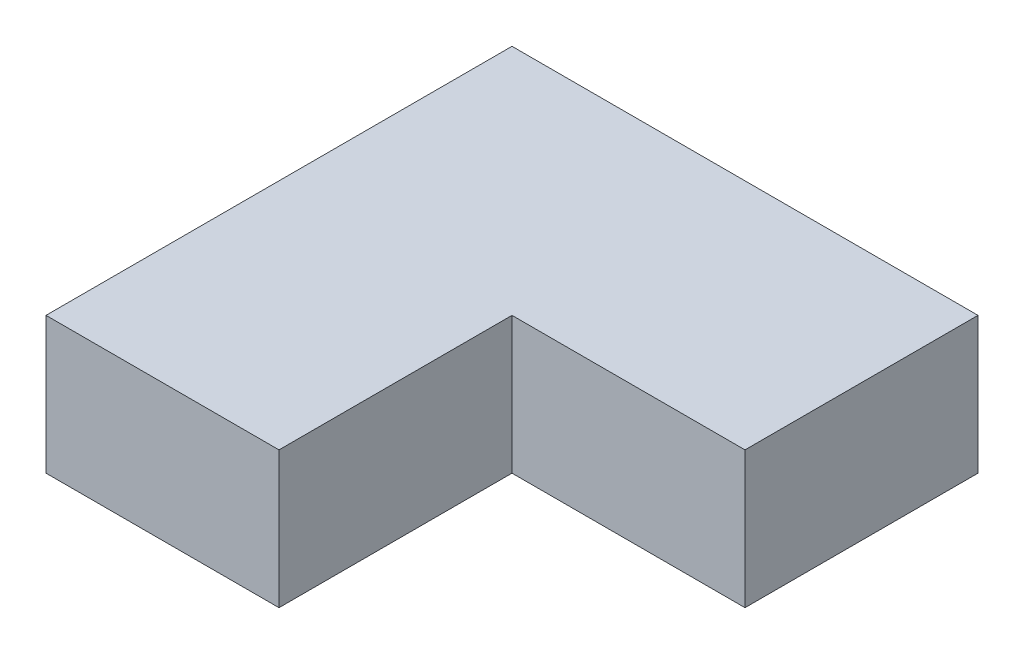
ISO-10303-21;
HEADER;
FILE_DESCRIPTION(('STEP AP214'),'2;1');
FILE_NAME('part.step','',(''),(''),'','','');
FILE_SCHEMA(('AUTOMOTIVE_DESIGN { 1 0 10303 214 1 1 1 1 }'));
ENDSEC;
DATA;
#1=APPLICATION_CONTEXT('core data for automotive mechanical design processes');
#2=APPLICATION_PROTOCOL_DEFINITION('international standard','automotive_design',2000,#1);
#3=PRODUCT_CONTEXT('',#1,'mechanical');
#4=PRODUCT('Part','Part','',(#3));
#5=PRODUCT_RELATED_PRODUCT_CATEGORY('part','',(#4));
#6=PRODUCT_DEFINITION_FORMATION('','',#4);
#7=PRODUCT_DEFINITION_CONTEXT('part definition',#1,'design');
#8=PRODUCT_DEFINITION('design','',#6,#7);
#9=PRODUCT_DEFINITION_SHAPE('','',#8);
#10=(LENGTH_UNIT() NAMED_UNIT(*) SI_UNIT(.MILLI.,.METRE.));
#11=(NAMED_UNIT(*) PLANE_ANGLE_UNIT() SI_UNIT($,.RADIAN.));
#12=(NAMED_UNIT(*) SI_UNIT($,.STERADIAN.) SOLID_ANGLE_UNIT());
#13=UNCERTAINTY_MEASURE_WITH_UNIT(LENGTH_MEASURE(1.E-05),#10,'distance_accuracy_value','');
#14=(GEOMETRIC_REPRESENTATION_CONTEXT(3) GLOBAL_UNCERTAINTY_ASSIGNED_CONTEXT((#13)) GLOBAL_UNIT_ASSIGNED_CONTEXT((#10,
#11,#12)) REPRESENTATION_CONTEXT('',''));
#15=CARTESIAN_POINT('',(0.,0.,0.));
#16=DIRECTION('',(0.,0.,1.));
#17=DIRECTION('',(1.,0.,0.));
#18=AXIS2_PLACEMENT_3D('',#15,#16,#17);
#19=CARTESIAN_POINT('',(37.5,22.,-37.5));
#20=DIRECTION('',(-1.,0.,0.));
#21=DIRECTION('',(0.,0.,1.));
#22=AXIS2_PLACEMENT_3D('',#19,#20,#21);
#23=PLANE('',#22);
#24=DIRECTION('',(0.,0.,-1.));
#25=VECTOR('',#24,1.);
#26=CARTESIAN_POINT('',(37.5,22.,-37.5));
#27=LINE('',#26,#25);
#28=CARTESIAN_POINT('',(37.5,22.,0.));
#29=VERTEX_POINT('',#28);
#30=CARTESIAN_POINT('',(37.5,22.,-37.5));
#31=VERTEX_POINT('',#30);
#32=EDGE_CURVE('E82',#29,#31,#27,.T.);
#33=ORIENTED_EDGE('',*,*,#32,.F.);
#34=DIRECTION('',(0.,1.,0.));
#35=VECTOR('',#34,1.);
#36=CARTESIAN_POINT('',(37.5,0.,0.));
#37=LINE('',#36,#35);
#38=CARTESIAN_POINT('',(37.5,0.,0.));
#39=VERTEX_POINT('',#38);
#40=EDGE_CURVE('E102',#39,#29,#37,.T.);
#41=ORIENTED_EDGE('',*,*,#40,.F.);
#42=DIRECTION('',(0.,0.,-1.));
#43=VECTOR('',#42,1.);
#44=CARTESIAN_POINT('',(37.5,0.,-37.5));
#45=LINE('',#44,#43);
#46=CARTESIAN_POINT('',(37.5,0.,-37.5));
#47=VERTEX_POINT('',#46);
#48=EDGE_CURVE('E110',#39,#47,#45,.T.);
#49=ORIENTED_EDGE('',*,*,#48,.T.);
#50=DIRECTION('',(0.,-1.,0.));
#51=VECTOR('',#50,1.);
#52=CARTESIAN_POINT('',(37.5,22.,-37.5));
#53=LINE('',#52,#51);
#54=EDGE_CURVE('E11',#31,#47,#53,.T.);
#55=ORIENTED_EDGE('',*,*,#54,.F.);
#56=EDGE_LOOP('',(#33,#41,#49,#55));
#57=FACE_BOUND('',#56,.T.);
#58=ADVANCED_FACE('F37',(#57),#23,.F.);
#59=CARTESIAN_POINT('',(-37.5,22.,-37.5));
#60=DIRECTION('',(0.,0.,1.));
#61=DIRECTION('',(1.,0.,0.));
#62=AXIS2_PLACEMENT_3D('',#59,#60,#61);
#63=PLANE('',#62);
#64=DIRECTION('',(-1.,0.,0.));
#65=VECTOR('',#64,1.);
#66=CARTESIAN_POINT('',(-37.5,0.,-37.5));
#67=LINE('',#66,#65);
#68=CARTESIAN_POINT('',(-37.5,0.,-37.5));
#69=VERTEX_POINT('',#68);
#70=EDGE_CURVE('E114',#47,#69,#67,.T.);
#71=ORIENTED_EDGE('',*,*,#70,.T.);
#72=DIRECTION('',(0.,-1.,0.));
#73=VECTOR('',#72,1.);
#74=CARTESIAN_POINT('',(-37.5,22.,-37.5));
#75=LINE('',#74,#73);
#76=CARTESIAN_POINT('',(-37.5,22.,-37.5));
#77=VERTEX_POINT('',#76);
#78=EDGE_CURVE('E44',#77,#69,#75,.T.);
#79=ORIENTED_EDGE('',*,*,#78,.F.);
#80=DIRECTION('',(-1.,0.,0.));
#81=VECTOR('',#80,1.);
#82=CARTESIAN_POINT('',(-37.5,22.,-37.5));
#83=LINE('',#82,#81);
#84=EDGE_CURVE('E137',#31,#77,#83,.T.);
#85=ORIENTED_EDGE('',*,*,#84,.F.);
#86=ORIENTED_EDGE('',*,*,#54,.T.);
#87=EDGE_LOOP('',(#71,#79,#85,#86));
#88=FACE_BOUND('',#87,.T.);
#89=ADVANCED_FACE('F156',(#88),#63,.F.);
#90=CARTESIAN_POINT('',(-37.5,22.,-37.5));
#91=DIRECTION('',(1.,0.,0.));
#92=DIRECTION('',(0.,0.,-1.));
#93=AXIS2_PLACEMENT_3D('',#90,#91,#92);
#94=PLANE('',#93);
#95=DIRECTION('',(0.,0.,1.));
#96=VECTOR('',#95,1.);
#97=CARTESIAN_POINT('',(-37.5,0.,-37.5));
#98=LINE('',#97,#96);
#99=CARTESIAN_POINT('',(-37.5,0.,37.5));
#100=VERTEX_POINT('',#99);
#101=EDGE_CURVE('E77',#69,#100,#98,.T.);
#102=ORIENTED_EDGE('',*,*,#101,.T.);
#103=DIRECTION('',(0.,-1.,0.));
#104=VECTOR('',#103,1.);
#105=CARTESIAN_POINT('',(-37.5,22.,37.5));
#106=LINE('',#105,#104);
#107=CARTESIAN_POINT('',(-37.5,22.,37.5));
#108=VERTEX_POINT('',#107);
#109=EDGE_CURVE('E128',#108,#100,#106,.T.);
#110=ORIENTED_EDGE('',*,*,#109,.F.);
#111=DIRECTION('',(0.,0.,1.));
#112=VECTOR('',#111,1.);
#113=CARTESIAN_POINT('',(-37.5,22.,-37.5));
#114=LINE('',#113,#112);
#115=EDGE_CURVE('E60',#77,#108,#114,.T.);
#116=ORIENTED_EDGE('',*,*,#115,.F.);
#117=ORIENTED_EDGE('',*,*,#78,.T.);
#118=EDGE_LOOP('',(#102,#110,#116,#117));
#119=FACE_BOUND('',#118,.T.);
#120=ADVANCED_FACE('F130',(#119),#94,.F.);
#121=CARTESIAN_POINT('',(-37.5,22.,37.5));
#122=DIRECTION('',(0.,0.,-1.));
#123=DIRECTION('',(-1.,0.,0.));
#124=AXIS2_PLACEMENT_3D('',#121,#122,#123);
#125=PLANE('',#124);
#126=DIRECTION('',(1.,0.,0.));
#127=VECTOR('',#126,1.);
#128=CARTESIAN_POINT('',(-37.5,0.,37.5));
#129=LINE('',#128,#127);
#130=CARTESIAN_POINT('',(0.,0.,37.5));
#131=VERTEX_POINT('',#130);
#132=EDGE_CURVE('E125',#100,#131,#129,.T.);
#133=ORIENTED_EDGE('',*,*,#132,.T.);
#134=DIRECTION('',(0.,1.,0.));
#135=VECTOR('',#134,1.);
#136=CARTESIAN_POINT('',(0.,0.,37.5));
#137=LINE('',#136,#135);
#138=CARTESIAN_POINT('',(0.,22.,37.5));
#139=VERTEX_POINT('',#138);
#140=EDGE_CURVE('E115',#131,#139,#137,.T.);
#141=ORIENTED_EDGE('',*,*,#140,.T.);
#142=DIRECTION('',(1.,0.,0.));
#143=VECTOR('',#142,1.);
#144=CARTESIAN_POINT('',(-37.5,22.,37.5));
#145=LINE('',#144,#143);
#146=EDGE_CURVE('E121',#108,#139,#145,.T.);
#147=ORIENTED_EDGE('',*,*,#146,.F.);
#148=ORIENTED_EDGE('',*,*,#109,.T.);
#149=EDGE_LOOP('',(#133,#141,#147,#148));
#150=FACE_BOUND('',#149,.T.);
#151=ADVANCED_FACE('F134',(#150),#125,.F.);
#152=CARTESIAN_POINT('',(0.,22.,0.));
#153=DIRECTION('',(0.,1.,0.));
#154=DIRECTION('',(0.,0.,1.));
#155=AXIS2_PLACEMENT_3D('',#152,#153,#154);
#156=PLANE('',#155);
#157=DIRECTION('',(0.,0.,1.));
#158=VECTOR('',#157,1.);
#159=CARTESIAN_POINT('',(0.,22.,37.5));
#160=LINE('',#159,#158);
#161=CARTESIAN_POINT('',(0.,22.,0.));
#162=VERTEX_POINT('',#161);
#163=EDGE_CURVE('E106',#162,#139,#160,.T.);
#164=ORIENTED_EDGE('',*,*,#163,.F.);
#165=DIRECTION('',(-1.,0.,0.));
#166=VECTOR('',#165,1.);
#167=CARTESIAN_POINT('',(37.5,22.,0.));
#168=LINE('',#167,#166);
#169=EDGE_CURVE('E143',#29,#162,#168,.T.);
#170=ORIENTED_EDGE('',*,*,#169,.F.);
#171=ORIENTED_EDGE('',*,*,#32,.T.);
#172=ORIENTED_EDGE('',*,*,#84,.T.);
#173=ORIENTED_EDGE('',*,*,#115,.T.);
#174=ORIENTED_EDGE('',*,*,#146,.T.);
#175=EDGE_LOOP('',(#164,#170,#171,#172,#173,#174));
#176=FACE_BOUND('',#175,.T.);
#177=ADVANCED_FACE('F145',(#176),#156,.T.);
#178=CARTESIAN_POINT('',(0.,0.,0.));
#179=DIRECTION('',(0.,1.,0.));
#180=DIRECTION('',(0.,0.,1.));
#181=AXIS2_PLACEMENT_3D('',#178,#179,#180);
#182=PLANE('',#181);
#183=DIRECTION('',(-1.,0.,0.));
#184=VECTOR('',#183,1.);
#185=CARTESIAN_POINT('',(37.5,0.,0.));
#186=LINE('',#185,#184);
#187=CARTESIAN_POINT('',(0.,0.,0.));
#188=VERTEX_POINT('',#187);
#189=EDGE_CURVE('E98',#39,#188,#186,.T.);
#190=ORIENTED_EDGE('',*,*,#189,.T.);
#191=DIRECTION('',(0.,0.,1.));
#192=VECTOR('',#191,1.);
#193=CARTESIAN_POINT('',(0.,0.,37.5));
#194=LINE('',#193,#192);
#195=EDGE_CURVE('E51',#188,#131,#194,.T.);
#196=ORIENTED_EDGE('',*,*,#195,.T.);
#197=ORIENTED_EDGE('',*,*,#132,.F.);
#198=ORIENTED_EDGE('',*,*,#101,.F.);
#199=ORIENTED_EDGE('',*,*,#70,.F.);
#200=ORIENTED_EDGE('',*,*,#48,.F.);
#201=EDGE_LOOP('',(#190,#196,#197,#198,#199,#200));
#202=FACE_BOUND('',#201,.T.);
#203=ADVANCED_FACE('F113',(#202),#182,.F.);
#204=CARTESIAN_POINT('',(0.,0.,37.5));
#205=DIRECTION('',(-1.,0.,0.));
#206=DIRECTION('',(0.,0.,1.));
#207=AXIS2_PLACEMENT_3D('',#204,#205,#206);
#208=PLANE('',#207);
#209=ORIENTED_EDGE('',*,*,#163,.T.);
#210=ORIENTED_EDGE('',*,*,#140,.F.);
#211=ORIENTED_EDGE('',*,*,#195,.F.);
#212=DIRECTION('',(0.,1.,0.));
#213=VECTOR('',#212,1.);
#214=CARTESIAN_POINT('',(0.,0.,0.));
#215=LINE('',#214,#213);
#216=EDGE_CURVE('E103',#188,#162,#215,.T.);
#217=ORIENTED_EDGE('',*,*,#216,.T.);
#218=EDGE_LOOP('',(#209,#210,#211,#217));
#219=FACE_BOUND('',#218,.T.);
#220=ADVANCED_FACE('F146',(#219),#208,.F.);
#221=CARTESIAN_POINT('',(37.5,0.,0.));
#222=DIRECTION('',(0.,0.,-1.));
#223=DIRECTION('',(-1.,0.,0.));
#224=AXIS2_PLACEMENT_3D('',#221,#222,#223);
#225=PLANE('',#224);
#226=ORIENTED_EDGE('',*,*,#169,.T.);
#227=ORIENTED_EDGE('',*,*,#216,.F.);
#228=ORIENTED_EDGE('',*,*,#189,.F.);
#229=ORIENTED_EDGE('',*,*,#40,.T.);
#230=EDGE_LOOP('',(#226,#227,#228,#229));
#231=FACE_BOUND('',#230,.T.);
#232=ADVANCED_FACE('F101',(#231),#225,.F.);
#233=CLOSED_SHELL('',(#58,#89,#120,#151,#177,#203,#220,#232));
#234=MANIFOLD_SOLID_BREP('B2',#233);
#235=ADVANCED_BREP_SHAPE_REPRESENTATION('',(#18,#234),#14);
#236=SHAPE_DEFINITION_REPRESENTATION(#9,#235);
ENDSEC;
END-ISO-10303-21;
